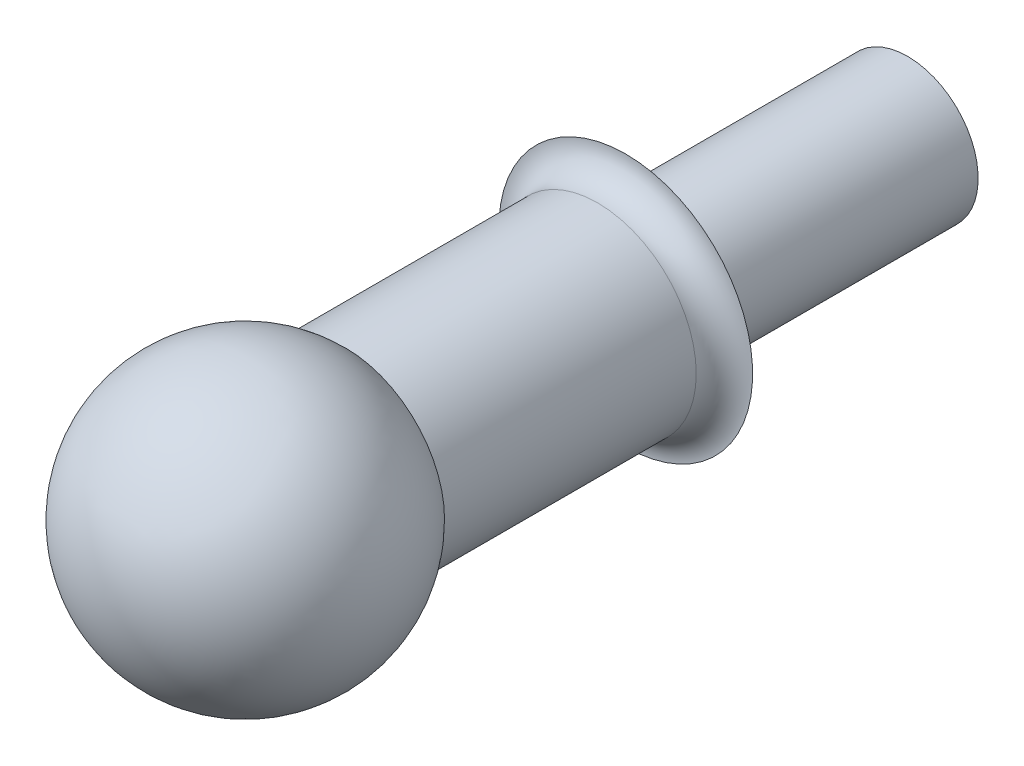
ISO-10303-21;
HEADER;
FILE_DESCRIPTION(('STEP AP214'),'2;1');
FILE_NAME('part.step','',(''),(''),'','','');
FILE_SCHEMA(('AUTOMOTIVE_DESIGN { 1 0 10303 214 1 1 1 1 }'));
ENDSEC;
DATA;
#1=APPLICATION_CONTEXT('core data for automotive mechanical design processes');
#2=APPLICATION_PROTOCOL_DEFINITION('international standard','automotive_design',2000,#1);
#3=PRODUCT_CONTEXT('',#1,'mechanical');
#4=PRODUCT('Part','Part','',(#3));
#5=PRODUCT_RELATED_PRODUCT_CATEGORY('part','',(#4));
#6=PRODUCT_DEFINITION_FORMATION('','',#4);
#7=PRODUCT_DEFINITION_CONTEXT('part definition',#1,'design');
#8=PRODUCT_DEFINITION('design','',#6,#7);
#9=PRODUCT_DEFINITION_SHAPE('','',#8);
#10=(LENGTH_UNIT() NAMED_UNIT(*) SI_UNIT(.MILLI.,.METRE.));
#11=(NAMED_UNIT(*) PLANE_ANGLE_UNIT() SI_UNIT($,.RADIAN.));
#12=(NAMED_UNIT(*) SI_UNIT($,.STERADIAN.) SOLID_ANGLE_UNIT());
#13=UNCERTAINTY_MEASURE_WITH_UNIT(LENGTH_MEASURE(1.E-05),#10,'distance_accuracy_value','');
#14=(GEOMETRIC_REPRESENTATION_CONTEXT(3) GLOBAL_UNCERTAINTY_ASSIGNED_CONTEXT((#13)) GLOBAL_UNIT_ASSIGNED_CONTEXT((#10,
#11,#12)) REPRESENTATION_CONTEXT('',''));
#15=CARTESIAN_POINT('',(0.,0.,0.));
#16=DIRECTION('',(0.,0.,1.));
#17=DIRECTION('',(1.,0.,0.));
#18=AXIS2_PLACEMENT_3D('',#15,#16,#17);
#19=CARTESIAN_POINT('',(91.6988035290815,-24.5,20.));
#20=DIRECTION('',(0.,0.,1.));
#21=DIRECTION('',(1.,0.,0.));
#22=AXIS2_PLACEMENT_3D('',#19,#20,#21);
#23=PLANE('',#22);
#24=CARTESIAN_POINT('',(80.,0.,20.));
#25=DIRECTION('',(0.,0.,-1.));
#26=DIRECTION('',(0.,1.,0.));
#27=AXIS2_PLACEMENT_3D('',#24,#25,#26);
#28=CIRCLE('',#27,4.5);
#29=CARTESIAN_POINT('',(80.,4.5,20.));
#30=VERTEX_POINT('',#29);
#31=EDGE_CURVE('E90',#30,#30,#28,.T.);
#32=ORIENTED_EDGE('',*,*,#31,.T.);
#33=EDGE_LOOP('',(#32));
#34=FACE_BOUND('',#33,.T.);
#35=CARTESIAN_POINT('',(80.,0.,20.));
#36=DIRECTION('',(0.,0.,-1.));
#37=DIRECTION('',(-1.,0.,0.));
#38=AXIS2_PLACEMENT_3D('',#35,#36,#37);
#39=CIRCLE('',#38,2.50000000000001);
#40=CARTESIAN_POINT('',(78.1001644808037,1.625,20.));
#41=VERTEX_POINT('',#40);
#42=CARTESIAN_POINT('',(78.1001644808037,-1.625,20.));
#43=VERTEX_POINT('',#42);
#44=EDGE_CURVE('E71',#41,#43,#39,.T.);
#45=ORIENTED_EDGE('',*,*,#44,.F.);
#46=DIRECTION('',(0.,1.,0.));
#47=VECTOR('',#46,1.);
#48=CARTESIAN_POINT('',(78.1001644808037,1.625,20.));
#49=LINE('',#48,#47);
#50=EDGE_CURVE('E58',#43,#41,#49,.T.);
#51=ORIENTED_EDGE('',*,*,#50,.F.);
#52=EDGE_LOOP('',(#45,#51));
#53=FACE_BOUND('',#52,.T.);
#54=ADVANCED_FACE('F43',(#34,#53),#23,.F.);
#55=CARTESIAN_POINT('',(80.,0.,21.));
#56=DIRECTION('',(0.,0.,-1.));
#57=DIRECTION('',(0.,1.,0.));
#58=AXIS2_PLACEMENT_3D('',#55,#56,#57);
#59=TOROIDAL_SURFACE('',#58,4.5,1.);
#60=CARTESIAN_POINT('',(80.,0.,21.));
#61=DIRECTION('',(0.,0.,-1.));
#62=DIRECTION('',(0.,1.,0.));
#63=AXIS2_PLACEMENT_3D('',#60,#61,#62);
#64=CIRCLE('',#63,3.5);
#65=CARTESIAN_POINT('',(80.,3.49999999999999,21.));
#66=VERTEX_POINT('',#65);
#67=EDGE_CURVE('E52',#66,#66,#64,.T.);
#68=ORIENTED_EDGE('',*,*,#67,.T.);
#69=EDGE_LOOP('',(#68));
#70=FACE_BOUND('',#69,.T.);
#71=ORIENTED_EDGE('',*,*,#31,.F.);
#72=EDGE_LOOP('',(#71));
#73=FACE_BOUND('',#72,.T.);
#74=ADVANCED_FACE('F45',(#70,#73),#59,.F.);
#75=CARTESIAN_POINT('',(80.,0.,-33.5));
#76=DIRECTION('',(0.,0.,-1.));
#77=DIRECTION('',(0.,1.,0.));
#78=AXIS2_PLACEMENT_3D('',#75,#76,#77);
#79=CYLINDRICAL_SURFACE('',#78,3.5);
#80=CARTESIAN_POINT('',(80.,0.,29.9292857857286));
#81=DIRECTION('',(0.,0.,1.));
#82=DIRECTION('',(0.,-1.,0.));
#83=AXIS2_PLACEMENT_3D('',#80,#81,#82);
#84=CIRCLE('',#83,3.5);
#85=CARTESIAN_POINT('',(80.,-3.5,29.9292857857286));
#86=VERTEX_POINT('',#85);
#87=EDGE_CURVE('E11',#86,#86,#84,.T.);
#88=ORIENTED_EDGE('',*,*,#87,.F.);
#89=EDGE_LOOP('',(#88));
#90=FACE_BOUND('',#89,.T.);
#91=ORIENTED_EDGE('',*,*,#67,.F.);
#92=EDGE_LOOP('',(#91));
#93=FACE_BOUND('',#92,.T.);
#94=ADVANCED_FACE('F102',(#90,#93),#79,.T.);
#95=CARTESIAN_POINT('',(80.,0.,33.5));
#96=DIRECTION('',(0.,1.,0.));
#97=DIRECTION('',(1.,0.,0.));
#98=AXIS2_PLACEMENT_3D('',#95,#96,#97);
#99=SPHERICAL_SURFACE('',#98,5.00000000000001);
#100=CARTESIAN_POINT('',(80.,0.,33.5));
#101=DIRECTION('',(0.,0.,1.));
#102=DIRECTION('',(0.,-1.,0.));
#103=AXIS2_PLACEMENT_3D('',#100,#101,#102);
#104=SPHERICAL_SURFACE('',#103,5.00000000000001);
#105=ORIENTED_EDGE('',*,*,#87,.T.);
#106=EDGE_LOOP('',(#105));
#107=FACE_BOUND('',#106,.T.);
#108=ADVANCED_FACE('F104',(#107),#104,.T.);
#109=CARTESIAN_POINT('',(80.,0.,10.));
#110=DIRECTION('',(0.,0.,1.));
#111=DIRECTION('',(1.,0.,0.));
#112=AXIS2_PLACEMENT_3D('',#109,#110,#111);
#113=CYLINDRICAL_SURFACE('',#112,2.50000000000001);
#114=ORIENTED_EDGE('',*,*,#44,.T.);
#115=DIRECTION('',(0.,0.,1.));
#116=VECTOR('',#115,1.);
#117=CARTESIAN_POINT('',(78.1001644808037,-1.625,10.));
#118=LINE('',#117,#116);
#119=CARTESIAN_POINT('',(78.1001644808037,-1.625,10.));
#120=VERTEX_POINT('',#119);
#121=EDGE_CURVE('E81',#120,#43,#118,.T.);
#122=ORIENTED_EDGE('',*,*,#121,.F.);
#123=CARTESIAN_POINT('',(80.,0.,10.));
#124=DIRECTION('',(0.,0.,-1.));
#125=DIRECTION('',(-1.,0.,0.));
#126=AXIS2_PLACEMENT_3D('',#123,#124,#125);
#127=CIRCLE('',#126,2.50000000000001);
#128=CARTESIAN_POINT('',(78.1001644808037,1.625,10.));
#129=VERTEX_POINT('',#128);
#130=EDGE_CURVE('E83',#129,#120,#127,.T.);
#131=ORIENTED_EDGE('',*,*,#130,.F.);
#132=DIRECTION('',(0.,0.,1.));
#133=VECTOR('',#132,1.);
#134=CARTESIAN_POINT('',(78.1001644808037,1.625,10.));
#135=LINE('',#134,#133);
#136=EDGE_CURVE('E79',#129,#41,#135,.T.);
#137=ORIENTED_EDGE('',*,*,#136,.T.);
#138=EDGE_LOOP('',(#114,#122,#131,#137));
#139=FACE_BOUND('',#138,.T.);
#140=ADVANCED_FACE('F85',(#139),#113,.T.);
#141=CARTESIAN_POINT('',(78.1001644808037,1.625,10.));
#142=DIRECTION('',(1.,0.,0.));
#143=DIRECTION('',(0.,0.,-1.));
#144=AXIS2_PLACEMENT_3D('',#141,#142,#143);
#145=PLANE('',#144);
#146=ORIENTED_EDGE('',*,*,#50,.T.);
#147=ORIENTED_EDGE('',*,*,#136,.F.);
#148=DIRECTION('',(0.,1.,0.));
#149=VECTOR('',#148,1.);
#150=CARTESIAN_POINT('',(78.1001644808037,1.625,10.));
#151=LINE('',#150,#149);
#152=EDGE_CURVE('E66',#120,#129,#151,.T.);
#153=ORIENTED_EDGE('',*,*,#152,.F.);
#154=ORIENTED_EDGE('',*,*,#121,.T.);
#155=EDGE_LOOP('',(#146,#147,#153,#154));
#156=FACE_BOUND('',#155,.T.);
#157=ADVANCED_FACE('F78',(#156),#145,.F.);
#158=CARTESIAN_POINT('',(80.,0.,10.));
#159=DIRECTION('',(0.,0.,-1.));
#160=DIRECTION('',(-1.,0.,0.));
#161=AXIS2_PLACEMENT_3D('',#158,#159,#160);
#162=PLANE('',#161);
#163=ORIENTED_EDGE('',*,*,#130,.T.);
#164=ORIENTED_EDGE('',*,*,#152,.T.);
#165=EDGE_LOOP('',(#163,#164));
#166=FACE_BOUND('',#165,.T.);
#167=ADVANCED_FACE('F123',(#166),#162,.T.);
#168=CLOSED_SHELL('',(#54,#74,#94,#108,#140,#157,#167));
#169=MANIFOLD_SOLID_BREP('B2',#168);
#170=ADVANCED_BREP_SHAPE_REPRESENTATION('',(#18,#169),#14);
#171=SHAPE_DEFINITION_REPRESENTATION(#9,#170);
ENDSEC;
END-ISO-10303-21;
